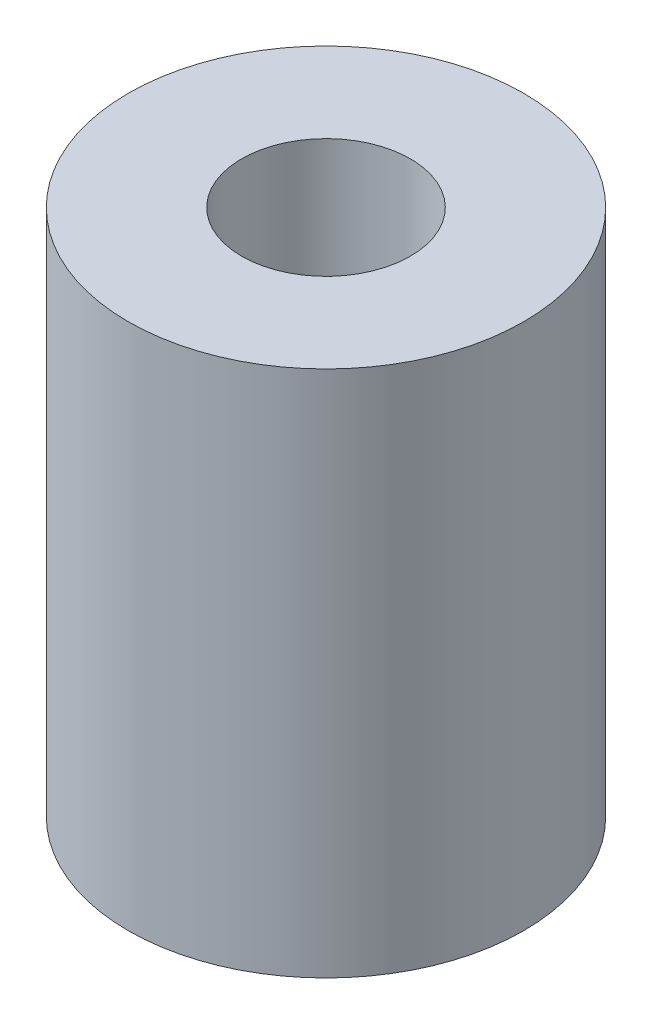
ISO-10303-21;
HEADER;
FILE_DESCRIPTION(('STEP AP214'),'2;1');
FILE_NAME('part.step','',(''),(''),'','','');
FILE_SCHEMA(('AUTOMOTIVE_DESIGN { 1 0 10303 214 1 1 1 1 }'));
ENDSEC;
DATA;
#1=APPLICATION_CONTEXT('core data for automotive mechanical design processes');
#2=APPLICATION_PROTOCOL_DEFINITION('international standard','automotive_design',2000,#1);
#3=PRODUCT_CONTEXT('',#1,'mechanical');
#4=PRODUCT('Part','Part','',(#3));
#5=PRODUCT_RELATED_PRODUCT_CATEGORY('part','',(#4));
#6=PRODUCT_DEFINITION_FORMATION('','',#4);
#7=PRODUCT_DEFINITION_CONTEXT('part definition',#1,'design');
#8=PRODUCT_DEFINITION('design','',#6,#7);
#9=PRODUCT_DEFINITION_SHAPE('','',#8);
#10=(LENGTH_UNIT() NAMED_UNIT(*) SI_UNIT(.MILLI.,.METRE.));
#11=(NAMED_UNIT(*) PLANE_ANGLE_UNIT() SI_UNIT($,.RADIAN.));
#12=(NAMED_UNIT(*) SI_UNIT($,.STERADIAN.) SOLID_ANGLE_UNIT());
#13=UNCERTAINTY_MEASURE_WITH_UNIT(LENGTH_MEASURE(1.E-05),#10,'distance_accuracy_value','');
#14=(GEOMETRIC_REPRESENTATION_CONTEXT(3) GLOBAL_UNCERTAINTY_ASSIGNED_CONTEXT((#13)) GLOBAL_UNIT_ASSIGNED_CONTEXT((#10,
#11,#12)) REPRESENTATION_CONTEXT('',''));
#15=CARTESIAN_POINT('',(0.,0.,0.));
#16=DIRECTION('',(0.,0.,1.));
#17=DIRECTION('',(1.,0.,0.));
#18=AXIS2_PLACEMENT_3D('',#15,#16,#17);
#19=CARTESIAN_POINT('',(0.,12.7,0.));
#20=DIRECTION('',(0.,1.,0.));
#21=DIRECTION('',(0.,0.,1.));
#22=AXIS2_PLACEMENT_3D('',#19,#20,#21);
#23=PLANE('',#22);
#24=CARTESIAN_POINT('',(0.,12.7,0.));
#25=DIRECTION('',(0.,1.,0.));
#26=DIRECTION('',(0.,0.,1.));
#27=AXIS2_PLACEMENT_3D('',#24,#25,#26);
#28=CIRCLE('',#27,4.7625);
#29=CARTESIAN_POINT('',(0.,12.7,4.7625));
#30=VERTEX_POINT('',#29);
#31=EDGE_CURVE('E10',#30,#30,#28,.T.);
#32=ORIENTED_EDGE('',*,*,#31,.T.);
#33=EDGE_LOOP('',(#32));
#34=FACE_BOUND('',#33,.T.);
#35=CARTESIAN_POINT('',(0.,12.7,0.));
#36=DIRECTION('',(0.,1.,0.));
#37=DIRECTION('',(0.,0.,1.));
#38=AXIS2_PLACEMENT_3D('',#35,#36,#37);
#39=CIRCLE('',#38,2.032);
#40=CARTESIAN_POINT('',(0.,12.7,2.032));
#41=VERTEX_POINT('',#40);
#42=EDGE_CURVE('E52',#41,#41,#39,.T.);
#43=ORIENTED_EDGE('',*,*,#42,.F.);
#44=EDGE_LOOP('',(#43));
#45=FACE_BOUND('',#44,.T.);
#46=ADVANCED_FACE('F41',(#34,#45),#23,.T.);
#47=CARTESIAN_POINT('',(0.,0.,0.));
#48=DIRECTION('',(0.,1.,0.));
#49=DIRECTION('',(0.,0.,1.));
#50=AXIS2_PLACEMENT_3D('',#47,#48,#49);
#51=PLANE('',#50);
#52=CARTESIAN_POINT('',(0.,0.,0.));
#53=DIRECTION('',(0.,1.,0.));
#54=DIRECTION('',(0.,0.,1.));
#55=AXIS2_PLACEMENT_3D('',#52,#53,#54);
#56=CIRCLE('',#55,4.7625);
#57=CARTESIAN_POINT('',(0.,0.,4.7625));
#58=VERTEX_POINT('',#57);
#59=EDGE_CURVE('E45',#58,#58,#56,.T.);
#60=ORIENTED_EDGE('',*,*,#59,.F.);
#61=EDGE_LOOP('',(#60));
#62=FACE_BOUND('',#61,.T.);
#63=CARTESIAN_POINT('',(0.,0.,0.));
#64=DIRECTION('',(0.,1.,0.));
#65=DIRECTION('',(0.,0.,1.));
#66=AXIS2_PLACEMENT_3D('',#63,#64,#65);
#67=CIRCLE('',#66,2.032);
#68=CARTESIAN_POINT('',(0.,0.,2.032));
#69=VERTEX_POINT('',#68);
#70=EDGE_CURVE('E54',#69,#69,#67,.T.);
#71=ORIENTED_EDGE('',*,*,#70,.T.);
#72=EDGE_LOOP('',(#71));
#73=FACE_BOUND('',#72,.T.);
#74=ADVANCED_FACE('F64',(#62,#73),#51,.F.);
#75=CARTESIAN_POINT('',(0.,12.7,0.));
#76=DIRECTION('',(0.,-1.,0.));
#77=DIRECTION('',(0.,0.,-1.));
#78=AXIS2_PLACEMENT_3D('',#75,#76,#77);
#79=CYLINDRICAL_SURFACE('',#78,4.7625);
#80=ORIENTED_EDGE('',*,*,#31,.F.);
#81=EDGE_LOOP('',(#80));
#82=FACE_BOUND('',#81,.T.);
#83=ORIENTED_EDGE('',*,*,#59,.T.);
#84=EDGE_LOOP('',(#83));
#85=FACE_BOUND('',#84,.T.);
#86=ADVANCED_FACE('F43',(#82,#85),#79,.T.);
#87=CARTESIAN_POINT('',(0.,12.7,0.));
#88=DIRECTION('',(0.,-1.,0.));
#89=DIRECTION('',(0.,0.,-1.));
#90=AXIS2_PLACEMENT_3D('',#87,#88,#89);
#91=CYLINDRICAL_SURFACE('',#90,2.032);
#92=ORIENTED_EDGE('',*,*,#42,.T.);
#93=EDGE_LOOP('',(#92));
#94=FACE_BOUND('',#93,.T.);
#95=ORIENTED_EDGE('',*,*,#70,.F.);
#96=EDGE_LOOP('',(#95));
#97=FACE_BOUND('',#96,.T.);
#98=ADVANCED_FACE('F60',(#94,#97),#91,.F.);
#99=CLOSED_SHELL('',(#46,#74,#86,#98));
#100=MANIFOLD_SOLID_BREP('B2',#99);
#101=ADVANCED_BREP_SHAPE_REPRESENTATION('',(#18,#100),#14);
#102=SHAPE_DEFINITION_REPRESENTATION(#9,#101);
ENDSEC;
END-ISO-10303-21;
